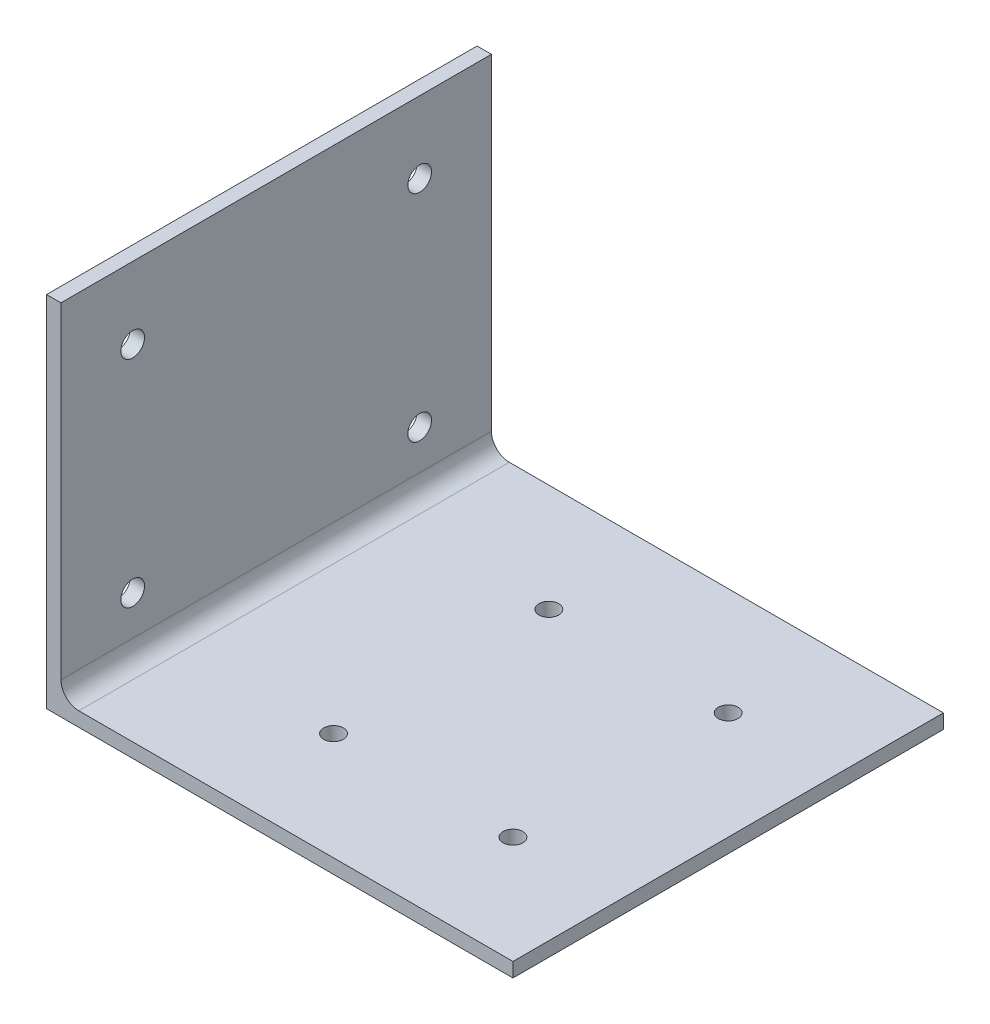
ISO-10303-21;
HEADER;
FILE_DESCRIPTION(('STEP AP214'),'2;1');
FILE_NAME('part.step','',(''),(''),'','','');
FILE_SCHEMA(('AUTOMOTIVE_DESIGN { 1 0 10303 214 1 1 1 1 }'));
ENDSEC;
DATA;
#1=APPLICATION_CONTEXT('core data for automotive mechanical design processes');
#2=APPLICATION_PROTOCOL_DEFINITION('international standard','automotive_design',2000,#1);
#3=PRODUCT_CONTEXT('',#1,'mechanical');
#4=PRODUCT('Part','Part','',(#3));
#5=PRODUCT_RELATED_PRODUCT_CATEGORY('part','',(#4));
#6=PRODUCT_DEFINITION_FORMATION('','',#4);
#7=PRODUCT_DEFINITION_CONTEXT('part definition',#1,'design');
#8=PRODUCT_DEFINITION('design','',#6,#7);
#9=PRODUCT_DEFINITION_SHAPE('','',#8);
#10=(LENGTH_UNIT() NAMED_UNIT(*) SI_UNIT(.MILLI.,.METRE.));
#11=(NAMED_UNIT(*) PLANE_ANGLE_UNIT() SI_UNIT($,.RADIAN.));
#12=(NAMED_UNIT(*) SI_UNIT($,.STERADIAN.) SOLID_ANGLE_UNIT());
#13=UNCERTAINTY_MEASURE_WITH_UNIT(LENGTH_MEASURE(1.E-05),#10,'distance_accuracy_value','');
#14=(GEOMETRIC_REPRESENTATION_CONTEXT(3) GLOBAL_UNCERTAINTY_ASSIGNED_CONTEXT((#13)) GLOBAL_UNIT_ASSIGNED_CONTEXT((#10,
#11,#12)) REPRESENTATION_CONTEXT('',''));
#15=CARTESIAN_POINT('',(0.,0.,0.));
#16=DIRECTION('',(0.,0.,1.));
#17=DIRECTION('',(1.,0.,0.));
#18=AXIS2_PLACEMENT_3D('',#15,#16,#17);
#19=CARTESIAN_POINT('',(130.,0.,120.));
#20=DIRECTION('',(0.,1.,0.));
#21=DIRECTION('',(-1.,0.,0.));
#22=AXIS2_PLACEMENT_3D('',#19,#20,#21);
#23=PLANE('',#22);
#24=CARTESIAN_POINT('',(100.,0.,90.));
#25=DIRECTION('',(0.,1.,0.));
#26=DIRECTION('',(-1.,0.,0.));
#27=AXIS2_PLACEMENT_3D('',#24,#25,#26);
#28=CIRCLE('',#27,2.75000000000001);
#29=CARTESIAN_POINT('',(97.25,0.,90.));
#30=VERTEX_POINT('',#29);
#31=EDGE_CURVE('E181',#30,#30,#28,.T.);
#32=ORIENTED_EDGE('',*,*,#31,.T.);
#33=EDGE_LOOP('',(#32));
#34=FACE_BOUND('',#33,.T.);
#35=CARTESIAN_POINT('',(50.,0.,90.));
#36=DIRECTION('',(0.,1.,0.));
#37=DIRECTION('',(-1.,0.,0.));
#38=AXIS2_PLACEMENT_3D('',#35,#36,#37);
#39=CIRCLE('',#38,2.75);
#40=CARTESIAN_POINT('',(47.25,0.,90.));
#41=VERTEX_POINT('',#40);
#42=EDGE_CURVE('E188',#41,#41,#39,.T.);
#43=ORIENTED_EDGE('',*,*,#42,.T.);
#44=EDGE_LOOP('',(#43));
#45=FACE_BOUND('',#44,.T.);
#46=CARTESIAN_POINT('',(50.,0.,30.));
#47=DIRECTION('',(0.,1.,0.));
#48=DIRECTION('',(-1.,0.,0.));
#49=AXIS2_PLACEMENT_3D('',#46,#47,#48);
#50=CIRCLE('',#49,2.75);
#51=CARTESIAN_POINT('',(47.25,0.,30.));
#52=VERTEX_POINT('',#51);
#53=EDGE_CURVE('E191',#52,#52,#50,.T.);
#54=ORIENTED_EDGE('',*,*,#53,.T.);
#55=EDGE_LOOP('',(#54));
#56=FACE_BOUND('',#55,.T.);
#57=CARTESIAN_POINT('',(100.,0.,30.));
#58=DIRECTION('',(0.,1.,0.));
#59=DIRECTION('',(-1.,0.,0.));
#60=AXIS2_PLACEMENT_3D('',#57,#58,#59);
#61=CIRCLE('',#60,2.75000000000001);
#62=CARTESIAN_POINT('',(97.25,0.,30.));
#63=VERTEX_POINT('',#62);
#64=EDGE_CURVE('E162',#63,#63,#61,.T.);
#65=ORIENTED_EDGE('',*,*,#64,.T.);
#66=EDGE_LOOP('',(#65));
#67=FACE_BOUND('',#66,.T.);
#68=DIRECTION('',(1.,0.,0.));
#69=VECTOR('',#68,1.);
#70=CARTESIAN_POINT('',(130.,0.,0.));
#71=LINE('',#70,#69);
#72=CARTESIAN_POINT('',(0.,0.,0.));
#73=VERTEX_POINT('',#72);
#74=CARTESIAN_POINT('',(130.,0.,0.));
#75=VERTEX_POINT('',#74);
#76=EDGE_CURVE('E119',#73,#75,#71,.T.);
#77=ORIENTED_EDGE('',*,*,#76,.T.);
#78=DIRECTION('',(0.,0.,-1.));
#79=VECTOR('',#78,1.);
#80=CARTESIAN_POINT('',(130.,0.,120.));
#81=LINE('',#80,#79);
#82=CARTESIAN_POINT('',(130.,0.,120.));
#83=VERTEX_POINT('',#82);
#84=EDGE_CURVE('E105',#83,#75,#81,.T.);
#85=ORIENTED_EDGE('',*,*,#84,.F.);
#86=DIRECTION('',(1.,0.,0.));
#87=VECTOR('',#86,1.);
#88=CARTESIAN_POINT('',(130.,0.,120.));
#89=LINE('',#88,#87);
#90=CARTESIAN_POINT('',(0.,0.,120.));
#91=VERTEX_POINT('',#90);
#92=EDGE_CURVE('E107',#91,#83,#89,.T.);
#93=ORIENTED_EDGE('',*,*,#92,.F.);
#94=DIRECTION('',(0.,0.,-1.));
#95=VECTOR('',#94,1.);
#96=CARTESIAN_POINT('',(0.,0.,120.));
#97=LINE('',#96,#95);
#98=EDGE_CURVE('E133',#91,#73,#97,.T.);
#99=ORIENTED_EDGE('',*,*,#98,.T.);
#100=EDGE_LOOP('',(#77,#85,#93,#99));
#101=FACE_BOUND('',#100,.T.);
#102=ADVANCED_FACE('F39',(#34,#45,#56,#67,#101),#23,.F.);
#103=CARTESIAN_POINT('',(130.,4.,120.));
#104=DIRECTION('',(-1.,0.,0.));
#105=DIRECTION('',(0.,0.,1.));
#106=AXIS2_PLACEMENT_3D('',#103,#104,#105);
#107=PLANE('',#106);
#108=DIRECTION('',(0.,1.,0.));
#109=VECTOR('',#108,1.);
#110=CARTESIAN_POINT('',(130.,4.,0.));
#111=LINE('',#110,#109);
#112=CARTESIAN_POINT('',(130.,4.,0.));
#113=VERTEX_POINT('',#112);
#114=EDGE_CURVE('E141',#75,#113,#111,.T.);
#115=ORIENTED_EDGE('',*,*,#114,.T.);
#116=DIRECTION('',(0.,0.,-1.));
#117=VECTOR('',#116,1.);
#118=CARTESIAN_POINT('',(130.,4.,120.));
#119=LINE('',#118,#117);
#120=CARTESIAN_POINT('',(130.,4.,120.));
#121=VERTEX_POINT('',#120);
#122=EDGE_CURVE('E104',#121,#113,#119,.T.);
#123=ORIENTED_EDGE('',*,*,#122,.F.);
#124=DIRECTION('',(0.,1.,0.));
#125=VECTOR('',#124,1.);
#126=CARTESIAN_POINT('',(130.,4.,120.));
#127=LINE('',#126,#125);
#128=EDGE_CURVE('E98',#83,#121,#127,.T.);
#129=ORIENTED_EDGE('',*,*,#128,.F.);
#130=ORIENTED_EDGE('',*,*,#84,.T.);
#131=EDGE_LOOP('',(#115,#123,#129,#130));
#132=FACE_BOUND('',#131,.T.);
#133=ADVANCED_FACE('F99',(#132),#107,.F.);
#134=CARTESIAN_POINT('',(4.00000000000001,4.,120.));
#135=DIRECTION('',(0.,-1.,0.));
#136=DIRECTION('',(1.,0.,0.));
#137=AXIS2_PLACEMENT_3D('',#134,#135,#136);
#138=PLANE('',#137);
#139=CARTESIAN_POINT('',(100.,4.,90.));
#140=DIRECTION('',(0.,1.,0.));
#141=DIRECTION('',(-1.,0.,0.));
#142=AXIS2_PLACEMENT_3D('',#139,#140,#141);
#143=CIRCLE('',#142,2.75000000000001);
#144=CARTESIAN_POINT('',(97.25,4.,90.));
#145=VERTEX_POINT('',#144);
#146=EDGE_CURVE('E186',#145,#145,#143,.T.);
#147=ORIENTED_EDGE('',*,*,#146,.F.);
#148=EDGE_LOOP('',(#147));
#149=FACE_BOUND('',#148,.T.);
#150=CARTESIAN_POINT('',(50.,4.,90.));
#151=DIRECTION('',(0.,1.,0.));
#152=DIRECTION('',(-1.,0.,0.));
#153=AXIS2_PLACEMENT_3D('',#150,#151,#152);
#154=CIRCLE('',#153,2.75);
#155=CARTESIAN_POINT('',(47.25,4.,90.));
#156=VERTEX_POINT('',#155);
#157=EDGE_CURVE('E195',#156,#156,#154,.T.);
#158=ORIENTED_EDGE('',*,*,#157,.F.);
#159=EDGE_LOOP('',(#158));
#160=FACE_BOUND('',#159,.T.);
#161=CARTESIAN_POINT('',(50.,4.,30.));
#162=DIRECTION('',(0.,1.,0.));
#163=DIRECTION('',(-1.,0.,0.));
#164=AXIS2_PLACEMENT_3D('',#161,#162,#163);
#165=CIRCLE('',#164,2.75);
#166=CARTESIAN_POINT('',(47.25,4.,30.));
#167=VERTEX_POINT('',#166);
#168=EDGE_CURVE('E176',#167,#167,#165,.T.);
#169=ORIENTED_EDGE('',*,*,#168,.F.);
#170=EDGE_LOOP('',(#169));
#171=FACE_BOUND('',#170,.T.);
#172=CARTESIAN_POINT('',(100.,4.,30.));
#173=DIRECTION('',(0.,1.,0.));
#174=DIRECTION('',(-1.,0.,0.));
#175=AXIS2_PLACEMENT_3D('',#172,#173,#174);
#176=CIRCLE('',#175,2.75000000000001);
#177=CARTESIAN_POINT('',(97.25,4.,30.));
#178=VERTEX_POINT('',#177);
#179=EDGE_CURVE('E180',#178,#178,#176,.T.);
#180=ORIENTED_EDGE('',*,*,#179,.F.);
#181=EDGE_LOOP('',(#180));
#182=FACE_BOUND('',#181,.T.);
#183=DIRECTION('',(-1.,0.,0.));
#184=VECTOR('',#183,1.);
#185=CARTESIAN_POINT('',(4.00000000000001,4.,0.));
#186=LINE('',#185,#184);
#187=CARTESIAN_POINT('',(9.00000000000001,4.,0.));
#188=VERTEX_POINT('',#187);
#189=EDGE_CURVE('E143',#113,#188,#186,.T.);
#190=ORIENTED_EDGE('',*,*,#189,.T.);
#191=DIRECTION('',(0.,0.,-1.));
#192=VECTOR('',#191,1.);
#193=CARTESIAN_POINT('',(9.00000000000001,4.,120.));
#194=LINE('',#193,#192);
#195=CARTESIAN_POINT('',(9.00000000000001,4.,120.));
#196=VERTEX_POINT('',#195);
#197=EDGE_CURVE('E53',#188,#196,#194,.F.);
#198=ORIENTED_EDGE('',*,*,#197,.T.);
#199=DIRECTION('',(-1.,0.,0.));
#200=VECTOR('',#199,1.);
#201=CARTESIAN_POINT('',(4.00000000000001,4.,120.));
#202=LINE('',#201,#200);
#203=EDGE_CURVE('E110',#121,#196,#202,.T.);
#204=ORIENTED_EDGE('',*,*,#203,.F.);
#205=ORIENTED_EDGE('',*,*,#122,.T.);
#206=EDGE_LOOP('',(#190,#198,#204,#205));
#207=FACE_BOUND('',#206,.T.);
#208=ADVANCED_FACE('F201',(#149,#160,#171,#182,#207),#138,.F.);
#209=CARTESIAN_POINT('',(4.,100.,120.));
#210=DIRECTION('',(-1.,0.,0.));
#211=DIRECTION('',(0.,-1.,0.));
#212=AXIS2_PLACEMENT_3D('',#209,#210,#211);
#213=PLANE('',#212);
#214=CARTESIAN_POINT('',(4.00000000000001,20.,100.));
#215=DIRECTION('',(1.,0.,0.));
#216=DIRECTION('',(0.,1.,0.));
#217=AXIS2_PLACEMENT_3D('',#214,#215,#216);
#218=CIRCLE('',#217,3.30000000000001);
#219=CARTESIAN_POINT('',(4.00000000000001,23.3,100.));
#220=VERTEX_POINT('',#219);
#221=EDGE_CURVE('E165',#220,#220,#218,.T.);
#222=ORIENTED_EDGE('',*,*,#221,.F.);
#223=EDGE_LOOP('',(#222));
#224=FACE_BOUND('',#223,.T.);
#225=CARTESIAN_POINT('',(4.00000000000001,20.,20.));
#226=DIRECTION('',(1.,0.,0.));
#227=DIRECTION('',(0.,1.,0.));
#228=AXIS2_PLACEMENT_3D('',#225,#226,#227);
#229=CIRCLE('',#228,3.3);
#230=CARTESIAN_POINT('',(4.00000000000001,23.3,20.));
#231=VERTEX_POINT('',#230);
#232=EDGE_CURVE('E166',#231,#231,#229,.T.);
#233=ORIENTED_EDGE('',*,*,#232,.F.);
#234=EDGE_LOOP('',(#233));
#235=FACE_BOUND('',#234,.T.);
#236=CARTESIAN_POINT('',(4.,80.,20.));
#237=DIRECTION('',(1.,0.,0.));
#238=DIRECTION('',(0.,1.,0.));
#239=AXIS2_PLACEMENT_3D('',#236,#237,#238);
#240=CIRCLE('',#239,3.3);
#241=CARTESIAN_POINT('',(4.,83.3,20.));
#242=VERTEX_POINT('',#241);
#243=EDGE_CURVE('E156',#242,#242,#240,.T.);
#244=ORIENTED_EDGE('',*,*,#243,.F.);
#245=EDGE_LOOP('',(#244));
#246=FACE_BOUND('',#245,.T.);
#247=CARTESIAN_POINT('',(4.,80.,100.));
#248=DIRECTION('',(1.,0.,0.));
#249=DIRECTION('',(0.,1.,0.));
#250=AXIS2_PLACEMENT_3D('',#247,#248,#249);
#251=CIRCLE('',#250,3.3);
#252=CARTESIAN_POINT('',(4.,83.3,100.));
#253=VERTEX_POINT('',#252);
#254=EDGE_CURVE('E153',#253,#253,#251,.T.);
#255=ORIENTED_EDGE('',*,*,#254,.F.);
#256=EDGE_LOOP('',(#255));
#257=FACE_BOUND('',#256,.T.);
#258=DIRECTION('',(0.,1.,0.));
#259=VECTOR('',#258,1.);
#260=CARTESIAN_POINT('',(4.,100.,120.));
#261=LINE('',#260,#259);
#262=CARTESIAN_POINT('',(4.00000000000001,8.99999999999999,120.));
#263=VERTEX_POINT('',#262);
#264=CARTESIAN_POINT('',(4.,100.,120.));
#265=VERTEX_POINT('',#264);
#266=EDGE_CURVE('E147',#263,#265,#261,.T.);
#267=ORIENTED_EDGE('',*,*,#266,.F.);
#268=DIRECTION('',(0.,0.,-1.));
#269=VECTOR('',#268,1.);
#270=CARTESIAN_POINT('',(4.00000000000001,8.99999999999999,0.));
#271=LINE('',#270,#269);
#272=CARTESIAN_POINT('',(4.00000000000001,8.99999999999999,0.));
#273=VERTEX_POINT('',#272);
#274=EDGE_CURVE('E122',#263,#273,#271,.T.);
#275=ORIENTED_EDGE('',*,*,#274,.T.);
#276=DIRECTION('',(0.,1.,0.));
#277=VECTOR('',#276,1.);
#278=CARTESIAN_POINT('',(4.,100.,0.));
#279=LINE('',#278,#277);
#280=CARTESIAN_POINT('',(4.,100.,0.));
#281=VERTEX_POINT('',#280);
#282=EDGE_CURVE('E139',#273,#281,#279,.T.);
#283=ORIENTED_EDGE('',*,*,#282,.T.);
#284=DIRECTION('',(0.,0.,-1.));
#285=VECTOR('',#284,1.);
#286=CARTESIAN_POINT('',(4.,100.,120.));
#287=LINE('',#286,#285);
#288=EDGE_CURVE('E121',#265,#281,#287,.T.);
#289=ORIENTED_EDGE('',*,*,#288,.F.);
#290=EDGE_LOOP('',(#267,#275,#283,#289));
#291=FACE_BOUND('',#290,.T.);
#292=ADVANCED_FACE('F206',(#224,#235,#246,#257,#291),#213,.F.);
#293=CARTESIAN_POINT('',(0.,100.,120.));
#294=DIRECTION('',(0.,-1.,0.));
#295=DIRECTION('',(0.,0.,-1.));
#296=AXIS2_PLACEMENT_3D('',#293,#294,#295);
#297=PLANE('',#296);
#298=DIRECTION('',(-1.,0.,0.));
#299=VECTOR('',#298,1.);
#300=CARTESIAN_POINT('',(0.,100.,0.));
#301=LINE('',#300,#299);
#302=CARTESIAN_POINT('',(0.,100.,0.));
#303=VERTEX_POINT('',#302);
#304=EDGE_CURVE('E140',#281,#303,#301,.T.);
#305=ORIENTED_EDGE('',*,*,#304,.T.);
#306=DIRECTION('',(0.,0.,-1.));
#307=VECTOR('',#306,1.);
#308=CARTESIAN_POINT('',(0.,100.,120.));
#309=LINE('',#308,#307);
#310=CARTESIAN_POINT('',(0.,100.,120.));
#311=VERTEX_POINT('',#310);
#312=EDGE_CURVE('E131',#311,#303,#309,.T.);
#313=ORIENTED_EDGE('',*,*,#312,.F.);
#314=DIRECTION('',(-1.,0.,0.));
#315=VECTOR('',#314,1.);
#316=CARTESIAN_POINT('',(0.,100.,120.));
#317=LINE('',#316,#315);
#318=EDGE_CURVE('E146',#265,#311,#317,.T.);
#319=ORIENTED_EDGE('',*,*,#318,.F.);
#320=ORIENTED_EDGE('',*,*,#288,.T.);
#321=EDGE_LOOP('',(#305,#313,#319,#320));
#322=FACE_BOUND('',#321,.T.);
#323=ADVANCED_FACE('F219',(#322),#297,.F.);
#324=CARTESIAN_POINT('',(0.,0.,120.));
#325=DIRECTION('',(1.,0.,0.));
#326=DIRECTION('',(0.,0.,-1.));
#327=AXIS2_PLACEMENT_3D('',#324,#325,#326);
#328=PLANE('',#327);
#329=CARTESIAN_POINT('',(0.,20.,100.));
#330=DIRECTION('',(1.,0.,0.));
#331=DIRECTION('',(0.,1.,0.));
#332=AXIS2_PLACEMENT_3D('',#329,#330,#331);
#333=CIRCLE('',#332,3.30000000000001);
#334=CARTESIAN_POINT('',(0.,23.3,100.));
#335=VERTEX_POINT('',#334);
#336=EDGE_CURVE('E157',#335,#335,#333,.T.);
#337=ORIENTED_EDGE('',*,*,#336,.T.);
#338=EDGE_LOOP('',(#337));
#339=FACE_BOUND('',#338,.T.);
#340=CARTESIAN_POINT('',(0.,20.,20.));
#341=DIRECTION('',(1.,0.,0.));
#342=DIRECTION('',(0.,1.,0.));
#343=AXIS2_PLACEMENT_3D('',#340,#341,#342);
#344=CIRCLE('',#343,3.3);
#345=CARTESIAN_POINT('',(0.,23.3,20.));
#346=VERTEX_POINT('',#345);
#347=EDGE_CURVE('E167',#346,#346,#344,.T.);
#348=ORIENTED_EDGE('',*,*,#347,.T.);
#349=EDGE_LOOP('',(#348));
#350=FACE_BOUND('',#349,.T.);
#351=CARTESIAN_POINT('',(0.,80.,20.));
#352=DIRECTION('',(1.,0.,0.));
#353=DIRECTION('',(0.,1.,0.));
#354=AXIS2_PLACEMENT_3D('',#351,#352,#353);
#355=CIRCLE('',#354,3.3);
#356=CARTESIAN_POINT('',(0.,83.3,20.));
#357=VERTEX_POINT('',#356);
#358=EDGE_CURVE('E175',#357,#357,#355,.T.);
#359=ORIENTED_EDGE('',*,*,#358,.T.);
#360=EDGE_LOOP('',(#359));
#361=FACE_BOUND('',#360,.T.);
#362=CARTESIAN_POINT('',(0.,80.,100.));
#363=DIRECTION('',(1.,0.,0.));
#364=DIRECTION('',(0.,1.,0.));
#365=AXIS2_PLACEMENT_3D('',#362,#363,#364);
#366=CIRCLE('',#365,3.3);
#367=CARTESIAN_POINT('',(0.,83.3,100.));
#368=VERTEX_POINT('',#367);
#369=EDGE_CURVE('E148',#368,#368,#366,.T.);
#370=ORIENTED_EDGE('',*,*,#369,.T.);
#371=EDGE_LOOP('',(#370));
#372=FACE_BOUND('',#371,.T.);
#373=DIRECTION('',(0.,-1.,0.));
#374=VECTOR('',#373,1.);
#375=CARTESIAN_POINT('',(0.,0.,0.));
#376=LINE('',#375,#374);
#377=EDGE_CURVE('E120',#303,#73,#376,.T.);
#378=ORIENTED_EDGE('',*,*,#377,.T.);
#379=ORIENTED_EDGE('',*,*,#98,.F.);
#380=DIRECTION('',(0.,-1.,0.));
#381=VECTOR('',#380,1.);
#382=CARTESIAN_POINT('',(0.,0.,120.));
#383=LINE('',#382,#381);
#384=EDGE_CURVE('E114',#311,#91,#383,.T.);
#385=ORIENTED_EDGE('',*,*,#384,.F.);
#386=ORIENTED_EDGE('',*,*,#312,.T.);
#387=EDGE_LOOP('',(#378,#379,#385,#386));
#388=FACE_BOUND('',#387,.T.);
#389=ADVANCED_FACE('F224',(#339,#350,#361,#372,#388),#328,.F.);
#390=CARTESIAN_POINT('',(0.,0.,120.));
#391=DIRECTION('',(0.,0.,-1.));
#392=DIRECTION('',(-1.,0.,0.));
#393=AXIS2_PLACEMENT_3D('',#390,#391,#392);
#394=PLANE('',#393);
#395=ORIENTED_EDGE('',*,*,#92,.T.);
#396=ORIENTED_EDGE('',*,*,#128,.T.);
#397=ORIENTED_EDGE('',*,*,#203,.T.);
#398=CARTESIAN_POINT('',(9.00000000000001,8.99999999999999,120.));
#399=DIRECTION('',(0.,0.,-1.));
#400=DIRECTION('',(-1.,0.,0.));
#401=AXIS2_PLACEMENT_3D('',#398,#399,#400);
#402=CIRCLE('',#401,5.);
#403=EDGE_CURVE('E11',#196,#263,#402,.T.);
#404=ORIENTED_EDGE('',*,*,#403,.T.);
#405=ORIENTED_EDGE('',*,*,#266,.T.);
#406=ORIENTED_EDGE('',*,*,#318,.T.);
#407=ORIENTED_EDGE('',*,*,#384,.T.);
#408=EDGE_LOOP('',(#395,#396,#397,#404,#405,#406,#407));
#409=FACE_BOUND('',#408,.T.);
#410=ADVANCED_FACE('F112',(#409),#394,.F.);
#411=CARTESIAN_POINT('',(0.,0.,0.));
#412=DIRECTION('',(0.,0.,-1.));
#413=DIRECTION('',(-1.,0.,0.));
#414=AXIS2_PLACEMENT_3D('',#411,#412,#413);
#415=PLANE('',#414);
#416=ORIENTED_EDGE('',*,*,#76,.F.);
#417=ORIENTED_EDGE('',*,*,#377,.F.);
#418=ORIENTED_EDGE('',*,*,#304,.F.);
#419=ORIENTED_EDGE('',*,*,#282,.F.);
#420=CARTESIAN_POINT('',(9.00000000000001,8.99999999999999,0.));
#421=DIRECTION('',(0.,0.,-1.));
#422=DIRECTION('',(-1.,0.,0.));
#423=AXIS2_PLACEMENT_3D('',#420,#421,#422);
#424=CIRCLE('',#423,5.);
#425=EDGE_CURVE('E50',#273,#188,#424,.F.);
#426=ORIENTED_EDGE('',*,*,#425,.T.);
#427=ORIENTED_EDGE('',*,*,#189,.F.);
#428=ORIENTED_EDGE('',*,*,#114,.F.);
#429=EDGE_LOOP('',(#416,#417,#418,#419,#426,#427,#428));
#430=FACE_BOUND('',#429,.T.);
#431=ADVANCED_FACE('F221',(#430),#415,.T.);
#432=CARTESIAN_POINT('',(0.,80.,100.));
#433=DIRECTION('',(1.,0.,0.));
#434=DIRECTION('',(0.,1.,0.));
#435=AXIS2_PLACEMENT_3D('',#432,#433,#434);
#436=CYLINDRICAL_SURFACE('',#435,3.3);
#437=ORIENTED_EDGE('',*,*,#369,.F.);
#438=EDGE_LOOP('',(#437));
#439=FACE_BOUND('',#438,.T.);
#440=ORIENTED_EDGE('',*,*,#254,.T.);
#441=EDGE_LOOP('',(#440));
#442=FACE_BOUND('',#441,.T.);
#443=ADVANCED_FACE('F226',(#439,#442),#436,.F.);
#444=CARTESIAN_POINT('',(0.,80.,20.));
#445=DIRECTION('',(1.,0.,0.));
#446=DIRECTION('',(0.,1.,0.));
#447=AXIS2_PLACEMENT_3D('',#444,#445,#446);
#448=CYLINDRICAL_SURFACE('',#447,3.3);
#449=ORIENTED_EDGE('',*,*,#358,.F.);
#450=EDGE_LOOP('',(#449));
#451=FACE_BOUND('',#450,.T.);
#452=ORIENTED_EDGE('',*,*,#243,.T.);
#453=EDGE_LOOP('',(#452));
#454=FACE_BOUND('',#453,.T.);
#455=ADVANCED_FACE('F233',(#451,#454),#448,.F.);
#456=CARTESIAN_POINT('',(0.,20.,20.));
#457=DIRECTION('',(1.,0.,0.));
#458=DIRECTION('',(0.,1.,0.));
#459=AXIS2_PLACEMENT_3D('',#456,#457,#458);
#460=CYLINDRICAL_SURFACE('',#459,3.3);
#461=ORIENTED_EDGE('',*,*,#347,.F.);
#462=EDGE_LOOP('',(#461));
#463=FACE_BOUND('',#462,.T.);
#464=ORIENTED_EDGE('',*,*,#232,.T.);
#465=EDGE_LOOP('',(#464));
#466=FACE_BOUND('',#465,.T.);
#467=ADVANCED_FACE('F267',(#463,#466),#460,.F.);
#468=CARTESIAN_POINT('',(0.,20.,100.));
#469=DIRECTION('',(1.,0.,0.));
#470=DIRECTION('',(0.,1.,0.));
#471=AXIS2_PLACEMENT_3D('',#468,#469,#470);
#472=CYLINDRICAL_SURFACE('',#471,3.30000000000001);
#473=ORIENTED_EDGE('',*,*,#336,.F.);
#474=EDGE_LOOP('',(#473));
#475=FACE_BOUND('',#474,.T.);
#476=ORIENTED_EDGE('',*,*,#221,.T.);
#477=EDGE_LOOP('',(#476));
#478=FACE_BOUND('',#477,.T.);
#479=ADVANCED_FACE('F277',(#475,#478),#472,.F.);
#480=CARTESIAN_POINT('',(100.,0.,30.));
#481=DIRECTION('',(0.,1.,0.));
#482=DIRECTION('',(-1.,0.,0.));
#483=AXIS2_PLACEMENT_3D('',#480,#481,#482);
#484=CYLINDRICAL_SURFACE('',#483,2.75000000000001);
#485=ORIENTED_EDGE('',*,*,#64,.F.);
#486=EDGE_LOOP('',(#485));
#487=FACE_BOUND('',#486,.T.);
#488=ORIENTED_EDGE('',*,*,#179,.T.);
#489=EDGE_LOOP('',(#488));
#490=FACE_BOUND('',#489,.T.);
#491=ADVANCED_FACE('F278',(#487,#490),#484,.F.);
#492=CARTESIAN_POINT('',(50.,0.,30.));
#493=DIRECTION('',(0.,1.,0.));
#494=DIRECTION('',(-1.,0.,0.));
#495=AXIS2_PLACEMENT_3D('',#492,#493,#494);
#496=CYLINDRICAL_SURFACE('',#495,2.75);
#497=ORIENTED_EDGE('',*,*,#53,.F.);
#498=EDGE_LOOP('',(#497));
#499=FACE_BOUND('',#498,.T.);
#500=ORIENTED_EDGE('',*,*,#168,.T.);
#501=EDGE_LOOP('',(#500));
#502=FACE_BOUND('',#501,.T.);
#503=ADVANCED_FACE('F203',(#499,#502),#496,.F.);
#504=CARTESIAN_POINT('',(50.,0.,90.));
#505=DIRECTION('',(0.,1.,0.));
#506=DIRECTION('',(-1.,0.,0.));
#507=AXIS2_PLACEMENT_3D('',#504,#505,#506);
#508=CYLINDRICAL_SURFACE('',#507,2.75);
#509=ORIENTED_EDGE('',*,*,#42,.F.);
#510=EDGE_LOOP('',(#509));
#511=FACE_BOUND('',#510,.T.);
#512=ORIENTED_EDGE('',*,*,#157,.T.);
#513=EDGE_LOOP('',(#512));
#514=FACE_BOUND('',#513,.T.);
#515=ADVANCED_FACE('F293',(#511,#514),#508,.F.);
#516=CARTESIAN_POINT('',(100.,0.,90.));
#517=DIRECTION('',(0.,1.,0.));
#518=DIRECTION('',(-1.,0.,0.));
#519=AXIS2_PLACEMENT_3D('',#516,#517,#518);
#520=CYLINDRICAL_SURFACE('',#519,2.75000000000001);
#521=ORIENTED_EDGE('',*,*,#31,.F.);
#522=EDGE_LOOP('',(#521));
#523=FACE_BOUND('',#522,.T.);
#524=ORIENTED_EDGE('',*,*,#146,.T.);
#525=EDGE_LOOP('',(#524));
#526=FACE_BOUND('',#525,.T.);
#527=ADVANCED_FACE('F304',(#523,#526),#520,.F.);
#528=CARTESIAN_POINT('',(9.00000000000001,8.99999999999999,120.));
#529=DIRECTION('',(0.,0.,1.));
#530=DIRECTION('',(1.,0.,0.));
#531=AXIS2_PLACEMENT_3D('',#528,#529,#530);
#532=CYLINDRICAL_SURFACE('',#531,5.);
#533=ORIENTED_EDGE('',*,*,#403,.F.);
#534=ORIENTED_EDGE('',*,*,#197,.F.);
#535=ORIENTED_EDGE('',*,*,#425,.F.);
#536=ORIENTED_EDGE('',*,*,#274,.F.);
#537=EDGE_LOOP('',(#533,#534,#535,#536));
#538=FACE_BOUND('',#537,.T.);
#539=ADVANCED_FACE('F41',(#538),#532,.F.);
#540=CLOSED_SHELL('',(#102,#133,#208,#292,#323,#389,#410,#431,#443,#455,#467,#479,#491,#503,
#515,#527,#539));
#541=MANIFOLD_SOLID_BREP('B2',#540);
#542=ADVANCED_BREP_SHAPE_REPRESENTATION('',(#18,#541),#14);
#543=SHAPE_DEFINITION_REPRESENTATION(#9,#542);
ENDSEC;
END-ISO-10303-21;
